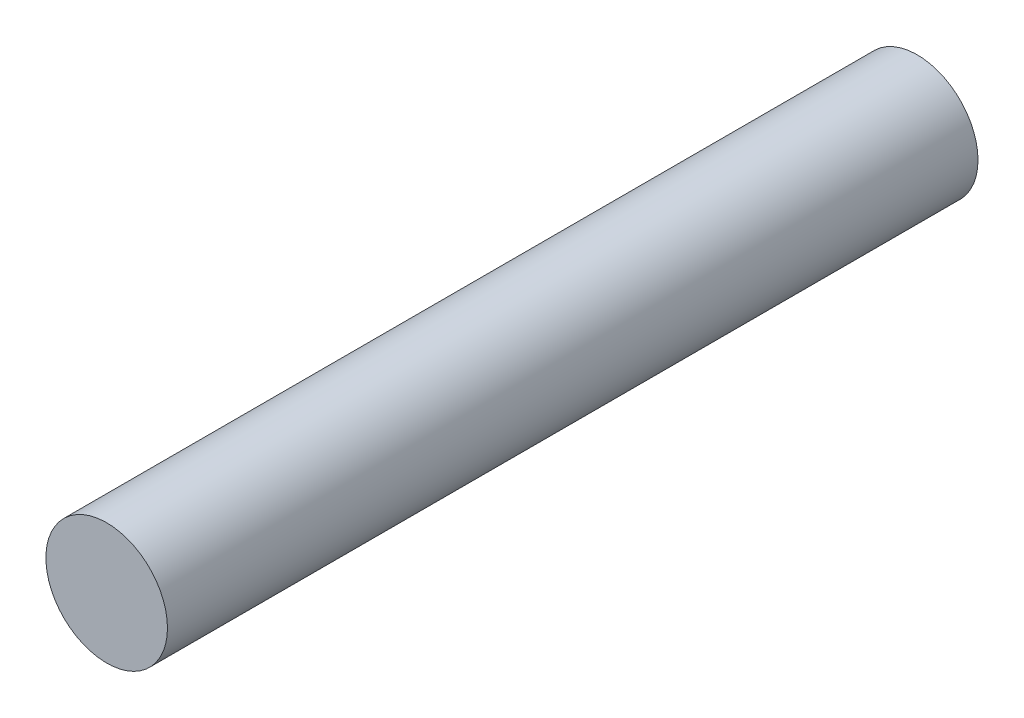
ISO-10303-21;
HEADER;
FILE_DESCRIPTION(('STEP AP214'),'2;1');
FILE_NAME('part.step','',(''),(''),'','','');
FILE_SCHEMA(('AUTOMOTIVE_DESIGN { 1 0 10303 214 1 1 1 1 }'));
ENDSEC;
DATA;
#1=APPLICATION_CONTEXT('core data for automotive mechanical design processes');
#2=APPLICATION_PROTOCOL_DEFINITION('international standard','automotive_design',2000,#1);
#3=PRODUCT_CONTEXT('',#1,'mechanical');
#4=PRODUCT('Part','Part','',(#3));
#5=PRODUCT_RELATED_PRODUCT_CATEGORY('part','',(#4));
#6=PRODUCT_DEFINITION_FORMATION('','',#4);
#7=PRODUCT_DEFINITION_CONTEXT('part definition',#1,'design');
#8=PRODUCT_DEFINITION('design','',#6,#7);
#9=PRODUCT_DEFINITION_SHAPE('','',#8);
#10=(LENGTH_UNIT() NAMED_UNIT(*) SI_UNIT(.MILLI.,.METRE.));
#11=(NAMED_UNIT(*) PLANE_ANGLE_UNIT() SI_UNIT($,.RADIAN.));
#12=(NAMED_UNIT(*) SI_UNIT($,.STERADIAN.) SOLID_ANGLE_UNIT());
#13=UNCERTAINTY_MEASURE_WITH_UNIT(LENGTH_MEASURE(1.E-05),#10,'distance_accuracy_value','');
#14=(GEOMETRIC_REPRESENTATION_CONTEXT(3) GLOBAL_UNCERTAINTY_ASSIGNED_CONTEXT((#13)) GLOBAL_UNIT_ASSIGNED_CONTEXT((#10,
#11,#12)) REPRESENTATION_CONTEXT('',''));
#15=CARTESIAN_POINT('',(0.,0.,0.));
#16=DIRECTION('',(0.,0.,1.));
#17=DIRECTION('',(1.,0.,0.));
#18=AXIS2_PLACEMENT_3D('',#15,#16,#17);
#19=CARTESIAN_POINT('',(0.,0.,127.));
#20=DIRECTION('',(0.,0.,-1.));
#21=DIRECTION('',(-1.,0.,0.));
#22=AXIS2_PLACEMENT_3D('',#19,#20,#21);
#23=CYLINDRICAL_SURFACE('',#22,9.525);
#24=CARTESIAN_POINT('',(0.,0.,127.));
#25=DIRECTION('',(0.,0.,1.));
#26=DIRECTION('',(1.,0.,0.));
#27=AXIS2_PLACEMENT_3D('',#24,#25,#26);
#28=CIRCLE('',#27,9.525);
#29=CARTESIAN_POINT('',(9.525,0.,127.));
#30=VERTEX_POINT('',#29);
#31=EDGE_CURVE('E10',#30,#30,#28,.T.);
#32=ORIENTED_EDGE('',*,*,#31,.F.);
#33=EDGE_LOOP('',(#32));
#34=FACE_BOUND('',#33,.T.);
#35=CARTESIAN_POINT('',(0.,0.,0.));
#36=DIRECTION('',(0.,0.,1.));
#37=DIRECTION('',(1.,0.,0.));
#38=AXIS2_PLACEMENT_3D('',#35,#36,#37);
#39=CIRCLE('',#38,9.525);
#40=CARTESIAN_POINT('',(9.525,0.,0.));
#41=VERTEX_POINT('',#40);
#42=EDGE_CURVE('E44',#41,#41,#39,.T.);
#43=ORIENTED_EDGE('',*,*,#42,.T.);
#44=EDGE_LOOP('',(#43));
#45=FACE_BOUND('',#44,.T.);
#46=ADVANCED_FACE('F41',(#34,#45),#23,.T.);
#47=CARTESIAN_POINT('',(0.,0.,127.));
#48=DIRECTION('',(0.,0.,1.));
#49=DIRECTION('',(1.,0.,0.));
#50=AXIS2_PLACEMENT_3D('',#47,#48,#49);
#51=PLANE('',#50);
#52=ORIENTED_EDGE('',*,*,#31,.T.);
#53=EDGE_LOOP('',(#52));
#54=FACE_BOUND('',#53,.T.);
#55=ADVANCED_FACE('F56',(#54),#51,.T.);
#56=CARTESIAN_POINT('',(0.,0.,0.));
#57=DIRECTION('',(0.,0.,1.));
#58=DIRECTION('',(1.,0.,0.));
#59=AXIS2_PLACEMENT_3D('',#56,#57,#58);
#60=PLANE('',#59);
#61=ORIENTED_EDGE('',*,*,#42,.F.);
#62=EDGE_LOOP('',(#61));
#63=FACE_BOUND('',#62,.T.);
#64=ADVANCED_FACE('F54',(#63),#60,.F.);
#65=CLOSED_SHELL('',(#46,#55,#64));
#66=MANIFOLD_SOLID_BREP('B2',#65);
#67=ADVANCED_BREP_SHAPE_REPRESENTATION('',(#18,#66),#14);
#68=SHAPE_DEFINITION_REPRESENTATION(#9,#67);
ENDSEC;
END-ISO-10303-21;
